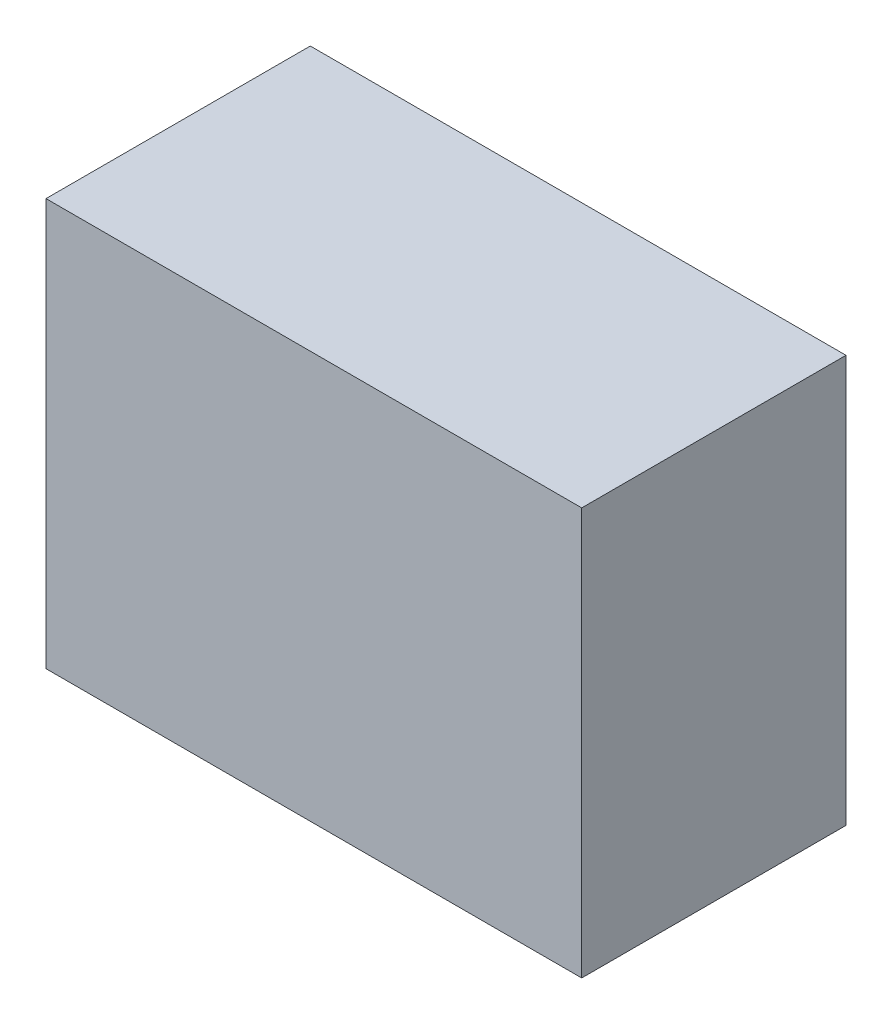
ISO-10303-21;
HEADER;
FILE_DESCRIPTION(('STEP AP214'),'2;1');
FILE_NAME('part.step','',(''),(''),'','','');
FILE_SCHEMA(('AUTOMOTIVE_DESIGN { 1 0 10303 214 1 1 1 1 }'));
ENDSEC;
DATA;
#1=APPLICATION_CONTEXT('core data for automotive mechanical design processes');
#2=APPLICATION_PROTOCOL_DEFINITION('international standard','automotive_design',2000,#1);
#3=PRODUCT_CONTEXT('',#1,'mechanical');
#4=PRODUCT('Part','Part','',(#3));
#5=PRODUCT_RELATED_PRODUCT_CATEGORY('part','',(#4));
#6=PRODUCT_DEFINITION_FORMATION('','',#4);
#7=PRODUCT_DEFINITION_CONTEXT('part definition',#1,'design');
#8=PRODUCT_DEFINITION('design','',#6,#7);
#9=PRODUCT_DEFINITION_SHAPE('','',#8);
#10=(LENGTH_UNIT() NAMED_UNIT(*) SI_UNIT(.MILLI.,.METRE.));
#11=(NAMED_UNIT(*) PLANE_ANGLE_UNIT() SI_UNIT($,.RADIAN.));
#12=(NAMED_UNIT(*) SI_UNIT($,.STERADIAN.) SOLID_ANGLE_UNIT());
#13=UNCERTAINTY_MEASURE_WITH_UNIT(LENGTH_MEASURE(1.E-05),#10,'distance_accuracy_value','');
#14=(GEOMETRIC_REPRESENTATION_CONTEXT(3) GLOBAL_UNCERTAINTY_ASSIGNED_CONTEXT((#13)) GLOBAL_UNIT_ASSIGNED_CONTEXT((#10,
#11,#12)) REPRESENTATION_CONTEXT('',''));
#15=CARTESIAN_POINT('',(0.,0.,0.));
#16=DIRECTION('',(0.,0.,1.));
#17=DIRECTION('',(1.,0.,0.));
#18=AXIS2_PLACEMENT_3D('',#15,#16,#17);
#19=CARTESIAN_POINT('',(0.,0.,37.));
#20=DIRECTION('',(1.,0.,0.));
#21=DIRECTION('',(0.,0.,-1.));
#22=AXIS2_PLACEMENT_3D('',#19,#20,#21);
#23=PLANE('',#22);
#24=DIRECTION('',(0.,-1.,0.));
#25=VECTOR('',#24,1.);
#26=CARTESIAN_POINT('',(0.,0.,0.));
#27=LINE('',#26,#25);
#28=CARTESIAN_POINT('',(0.,57.,0.));
#29=VERTEX_POINT('',#28);
#30=CARTESIAN_POINT('',(0.,0.,0.));
#31=VERTEX_POINT('',#30);
#32=EDGE_CURVE('E98',#29,#31,#27,.T.);
#33=ORIENTED_EDGE('',*,*,#32,.T.);
#34=DIRECTION('',(0.,0.,-1.));
#35=VECTOR('',#34,1.);
#36=CARTESIAN_POINT('',(0.,0.,37.));
#37=LINE('',#36,#35);
#38=CARTESIAN_POINT('',(0.,0.,37.));
#39=VERTEX_POINT('',#38);
#40=EDGE_CURVE('E11',#39,#31,#37,.T.);
#41=ORIENTED_EDGE('',*,*,#40,.F.);
#42=DIRECTION('',(0.,-1.,0.));
#43=VECTOR('',#42,1.);
#44=CARTESIAN_POINT('',(0.,0.,37.));
#45=LINE('',#44,#43);
#46=CARTESIAN_POINT('',(0.,57.,37.));
#47=VERTEX_POINT('',#46);
#48=EDGE_CURVE('E86',#47,#39,#45,.T.);
#49=ORIENTED_EDGE('',*,*,#48,.F.);
#50=DIRECTION('',(0.,0.,-1.));
#51=VECTOR('',#50,1.);
#52=CARTESIAN_POINT('',(0.,57.,37.));
#53=LINE('',#52,#51);
#54=EDGE_CURVE('E94',#47,#29,#53,.T.);
#55=ORIENTED_EDGE('',*,*,#54,.T.);
#56=EDGE_LOOP('',(#33,#41,#49,#55));
#57=FACE_BOUND('',#56,.T.);
#58=ADVANCED_FACE('F35',(#57),#23,.F.);
#59=CARTESIAN_POINT('',(0.,0.,37.));
#60=DIRECTION('',(0.,1.,0.));
#61=DIRECTION('',(0.,0.,1.));
#62=AXIS2_PLACEMENT_3D('',#59,#60,#61);
#63=PLANE('',#62);
#64=DIRECTION('',(1.,0.,0.));
#65=VECTOR('',#64,1.);
#66=CARTESIAN_POINT('',(0.,0.,0.));
#67=LINE('',#66,#65);
#68=CARTESIAN_POINT('',(75.,0.,0.));
#69=VERTEX_POINT('',#68);
#70=EDGE_CURVE('E90',#31,#69,#67,.T.);
#71=ORIENTED_EDGE('',*,*,#70,.T.);
#72=DIRECTION('',(0.,0.,-1.));
#73=VECTOR('',#72,1.);
#74=CARTESIAN_POINT('',(75.,0.,37.));
#75=LINE('',#74,#73);
#76=CARTESIAN_POINT('',(75.,0.,37.));
#77=VERTEX_POINT('',#76);
#78=EDGE_CURVE('E43',#77,#69,#75,.T.);
#79=ORIENTED_EDGE('',*,*,#78,.F.);
#80=DIRECTION('',(1.,0.,0.));
#81=VECTOR('',#80,1.);
#82=CARTESIAN_POINT('',(0.,0.,37.));
#83=LINE('',#82,#81);
#84=EDGE_CURVE('E81',#39,#77,#83,.T.);
#85=ORIENTED_EDGE('',*,*,#84,.F.);
#86=ORIENTED_EDGE('',*,*,#40,.T.);
#87=EDGE_LOOP('',(#71,#79,#85,#86));
#88=FACE_BOUND('',#87,.T.);
#89=ADVANCED_FACE('F89',(#88),#63,.F.);
#90=CARTESIAN_POINT('',(75.,0.,37.));
#91=DIRECTION('',(-1.,0.,0.));
#92=DIRECTION('',(0.,0.,1.));
#93=AXIS2_PLACEMENT_3D('',#90,#91,#92);
#94=PLANE('',#93);
#95=DIRECTION('',(0.,1.,0.));
#96=VECTOR('',#95,1.);
#97=CARTESIAN_POINT('',(75.,0.,0.));
#98=LINE('',#97,#96);
#99=CARTESIAN_POINT('',(75.,57.,0.));
#100=VERTEX_POINT('',#99);
#101=EDGE_CURVE('E68',#69,#100,#98,.T.);
#102=ORIENTED_EDGE('',*,*,#101,.T.);
#103=DIRECTION('',(0.,0.,-1.));
#104=VECTOR('',#103,1.);
#105=CARTESIAN_POINT('',(75.,57.,37.));
#106=LINE('',#105,#104);
#107=CARTESIAN_POINT('',(75.,57.,37.));
#108=VERTEX_POINT('',#107);
#109=EDGE_CURVE('E91',#108,#100,#106,.T.);
#110=ORIENTED_EDGE('',*,*,#109,.F.);
#111=DIRECTION('',(0.,1.,0.));
#112=VECTOR('',#111,1.);
#113=CARTESIAN_POINT('',(75.,0.,37.));
#114=LINE('',#113,#112);
#115=EDGE_CURVE('E84',#77,#108,#114,.T.);
#116=ORIENTED_EDGE('',*,*,#115,.F.);
#117=ORIENTED_EDGE('',*,*,#78,.T.);
#118=EDGE_LOOP('',(#102,#110,#116,#117));
#119=FACE_BOUND('',#118,.T.);
#120=ADVANCED_FACE('F92',(#119),#94,.F.);
#121=CARTESIAN_POINT('',(0.,57.,37.));
#122=DIRECTION('',(0.,-1.,0.));
#123=DIRECTION('',(0.,0.,-1.));
#124=AXIS2_PLACEMENT_3D('',#121,#122,#123);
#125=PLANE('',#124);
#126=DIRECTION('',(-1.,0.,0.));
#127=VECTOR('',#126,1.);
#128=CARTESIAN_POINT('',(0.,57.,0.));
#129=LINE('',#128,#127);
#130=EDGE_CURVE('E74',#100,#29,#129,.T.);
#131=ORIENTED_EDGE('',*,*,#130,.T.);
#132=ORIENTED_EDGE('',*,*,#54,.F.);
#133=DIRECTION('',(-1.,0.,0.));
#134=VECTOR('',#133,1.);
#135=CARTESIAN_POINT('',(0.,57.,37.));
#136=LINE('',#135,#134);
#137=EDGE_CURVE('E51',#108,#47,#136,.T.);
#138=ORIENTED_EDGE('',*,*,#137,.F.);
#139=ORIENTED_EDGE('',*,*,#109,.T.);
#140=EDGE_LOOP('',(#131,#132,#138,#139));
#141=FACE_BOUND('',#140,.T.);
#142=ADVANCED_FACE('F105',(#141),#125,.F.);
#143=CARTESIAN_POINT('',(0.,0.,37.));
#144=DIRECTION('',(0.,0.,-1.));
#145=DIRECTION('',(-1.,0.,0.));
#146=AXIS2_PLACEMENT_3D('',#143,#144,#145);
#147=PLANE('',#146);
#148=ORIENTED_EDGE('',*,*,#48,.T.);
#149=ORIENTED_EDGE('',*,*,#84,.T.);
#150=ORIENTED_EDGE('',*,*,#115,.T.);
#151=ORIENTED_EDGE('',*,*,#137,.T.);
#152=EDGE_LOOP('',(#148,#149,#150,#151));
#153=FACE_BOUND('',#152,.T.);
#154=ADVANCED_FACE('F82',(#153),#147,.F.);
#155=CARTESIAN_POINT('',(0.,0.,0.));
#156=DIRECTION('',(0.,0.,-1.));
#157=DIRECTION('',(-1.,0.,0.));
#158=AXIS2_PLACEMENT_3D('',#155,#156,#157);
#159=PLANE('',#158);
#160=ORIENTED_EDGE('',*,*,#32,.F.);
#161=ORIENTED_EDGE('',*,*,#130,.F.);
#162=ORIENTED_EDGE('',*,*,#101,.F.);
#163=ORIENTED_EDGE('',*,*,#70,.F.);
#164=EDGE_LOOP('',(#160,#161,#162,#163));
#165=FACE_BOUND('',#164,.T.);
#166=ADVANCED_FACE('F108',(#165),#159,.T.);
#167=CLOSED_SHELL('',(#58,#89,#120,#142,#154,#166));
#168=MANIFOLD_SOLID_BREP('B2',#167);
#169=ADVANCED_BREP_SHAPE_REPRESENTATION('',(#18,#168),#14);
#170=SHAPE_DEFINITION_REPRESENTATION(#9,#169);
ENDSEC;
END-ISO-10303-21;
